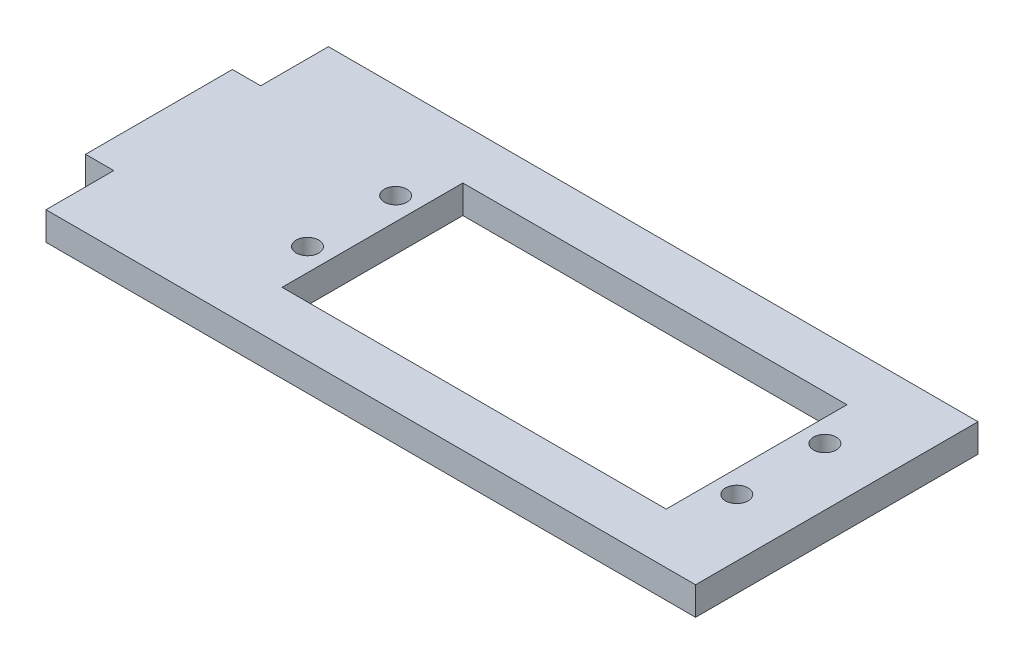
ISO-10303-21;
HEADER;
FILE_DESCRIPTION(('STEP AP214'),'2;1');
FILE_NAME('part.step','',(''),(''),'','','');
FILE_SCHEMA(('AUTOMOTIVE_DESIGN { 1 0 10303 214 1 1 1 1 }'));
ENDSEC;
DATA;
#1=APPLICATION_CONTEXT('core data for automotive mechanical design processes');
#2=APPLICATION_PROTOCOL_DEFINITION('international standard','automotive_design',2000,#1);
#3=PRODUCT_CONTEXT('',#1,'mechanical');
#4=PRODUCT('Part','Part','',(#3));
#5=PRODUCT_RELATED_PRODUCT_CATEGORY('part','',(#4));
#6=PRODUCT_DEFINITION_FORMATION('','',#4);
#7=PRODUCT_DEFINITION_CONTEXT('part definition',#1,'design');
#8=PRODUCT_DEFINITION('design','',#6,#7);
#9=PRODUCT_DEFINITION_SHAPE('','',#8);
#10=(LENGTH_UNIT() NAMED_UNIT(*) SI_UNIT(.MILLI.,.METRE.));
#11=(NAMED_UNIT(*) PLANE_ANGLE_UNIT() SI_UNIT($,.RADIAN.));
#12=(NAMED_UNIT(*) SI_UNIT($,.STERADIAN.) SOLID_ANGLE_UNIT());
#13=UNCERTAINTY_MEASURE_WITH_UNIT(LENGTH_MEASURE(1.E-05),#10,'distance_accuracy_value','');
#14=(GEOMETRIC_REPRESENTATION_CONTEXT(3) GLOBAL_UNCERTAINTY_ASSIGNED_CONTEXT((#13)) GLOBAL_UNIT_ASSIGNED_CONTEXT((#10,
#11,#12)) REPRESENTATION_CONTEXT('',''));
#15=CARTESIAN_POINT('',(0.,0.,0.));
#16=DIRECTION('',(0.,0.,1.));
#17=DIRECTION('',(1.,0.,0.));
#18=AXIS2_PLACEMENT_3D('',#15,#16,#17);
#19=CARTESIAN_POINT('',(43.5055368980985,3.175,-18.2399223929181));
#20=DIRECTION('',(-1.,0.,0.));
#21=DIRECTION('',(0.,0.,1.));
#22=AXIS2_PLACEMENT_3D('',#19,#20,#21);
#23=PLANE('',#22);
#24=DIRECTION('',(0.,0.,-1.));
#25=VECTOR('',#24,1.);
#26=CARTESIAN_POINT('',(43.5055368980985,0.,-18.2399223929181));
#27=LINE('',#26,#25);
#28=CARTESIAN_POINT('',(43.5055368980985,0.,13.5100776070819));
#29=VERTEX_POINT('',#28);
#30=CARTESIAN_POINT('',(43.5055368980985,0.,-18.2399223929181));
#31=VERTEX_POINT('',#30);
#32=EDGE_CURVE('E196',#29,#31,#27,.T.);
#33=ORIENTED_EDGE('',*,*,#32,.T.);
#34=DIRECTION('',(0.,-1.,0.));
#35=VECTOR('',#34,1.);
#36=CARTESIAN_POINT('',(43.5055368980985,3.175,-18.2399223929181));
#37=LINE('',#36,#35);
#38=CARTESIAN_POINT('',(43.5055368980985,3.175,-18.2399223929181));
#39=VERTEX_POINT('',#38);
#40=EDGE_CURVE('E11',#39,#31,#37,.T.);
#41=ORIENTED_EDGE('',*,*,#40,.F.);
#42=DIRECTION('',(0.,0.,-1.));
#43=VECTOR('',#42,1.);
#44=CARTESIAN_POINT('',(43.5055368980985,3.175,-18.2399223929181));
#45=LINE('',#44,#43);
#46=CARTESIAN_POINT('',(43.5055368980985,3.175,13.5100776070819));
#47=VERTEX_POINT('',#46);
#48=EDGE_CURVE('E200',#47,#39,#45,.T.);
#49=ORIENTED_EDGE('',*,*,#48,.F.);
#50=DIRECTION('',(0.,-1.,0.));
#51=VECTOR('',#50,1.);
#52=CARTESIAN_POINT('',(43.5055368980985,3.175,13.5100776070819));
#53=LINE('',#52,#51);
#54=EDGE_CURVE('E42',#47,#29,#53,.T.);
#55=ORIENTED_EDGE('',*,*,#54,.T.);
#56=EDGE_LOOP('',(#33,#41,#49,#55));
#57=FACE_BOUND('',#56,.T.);
#58=ADVANCED_FACE('F35',(#57),#23,.F.);
#59=CARTESIAN_POINT('',(-32.6944631019015,3.175,-18.2399223929181));
#60=DIRECTION('',(0.,0.,1.));
#61=DIRECTION('',(1.,0.,0.));
#62=AXIS2_PLACEMENT_3D('',#59,#60,#61);
#63=PLANE('',#62);
#64=DIRECTION('',(-1.,0.,0.));
#65=VECTOR('',#64,1.);
#66=CARTESIAN_POINT('',(-32.6944631019015,0.,-18.2399223929181));
#67=LINE('',#66,#65);
#68=CARTESIAN_POINT('',(-29.5194631019015,0.,-18.2399223929181));
#69=VERTEX_POINT('',#68);
#70=EDGE_CURVE('E214',#31,#69,#67,.T.);
#71=ORIENTED_EDGE('',*,*,#70,.T.);
#72=DIRECTION('',(0.,1.,0.));
#73=VECTOR('',#72,1.);
#74=CARTESIAN_POINT('',(-29.5194631019015,0.,-18.2399223929181));
#75=LINE('',#74,#73);
#76=CARTESIAN_POINT('',(-29.5194631019015,3.175,-18.2399223929181));
#77=VERTEX_POINT('',#76);
#78=EDGE_CURVE('E193',#69,#77,#75,.T.);
#79=ORIENTED_EDGE('',*,*,#78,.T.);
#80=DIRECTION('',(-1.,0.,0.));
#81=VECTOR('',#80,1.);
#82=CARTESIAN_POINT('',(-32.6944631019015,3.175,-18.2399223929181));
#83=LINE('',#82,#81);
#84=EDGE_CURVE('E203',#39,#77,#83,.T.);
#85=ORIENTED_EDGE('',*,*,#84,.F.);
#86=ORIENTED_EDGE('',*,*,#40,.T.);
#87=EDGE_LOOP('',(#71,#79,#85,#86));
#88=FACE_BOUND('',#87,.T.);
#89=ADVANCED_FACE('F230',(#88),#63,.F.);
#90=CARTESIAN_POINT('',(-32.6944631019015,3.175,-18.2399223929181));
#91=DIRECTION('',(1.,0.,0.));
#92=DIRECTION('',(0.,0.,-1.));
#93=AXIS2_PLACEMENT_3D('',#90,#91,#92);
#94=PLANE('',#93);
#95=DIRECTION('',(0.,0.,1.));
#96=VECTOR('',#95,1.);
#97=CARTESIAN_POINT('',(-32.6944631019015,0.,-18.2399223929181));
#98=LINE('',#97,#96);
#99=CARTESIAN_POINT('',(-32.6944631019015,0.,-10.6199223929181));
#100=VERTEX_POINT('',#99);
#101=CARTESIAN_POINT('',(-32.6944631019015,0.,5.89007760708189));
#102=VERTEX_POINT('',#101);
#103=EDGE_CURVE('E217',#100,#102,#98,.T.);
#104=ORIENTED_EDGE('',*,*,#103,.T.);
#105=DIRECTION('',(0.,1.,0.));
#106=VECTOR('',#105,1.);
#107=CARTESIAN_POINT('',(-32.6944631019015,0.,5.89007760708189));
#108=LINE('',#107,#106);
#109=CARTESIAN_POINT('',(-32.6944631019015,3.175,5.89007760708189));
#110=VERTEX_POINT('',#109);
#111=EDGE_CURVE('E175',#102,#110,#108,.T.);
#112=ORIENTED_EDGE('',*,*,#111,.T.);
#113=DIRECTION('',(0.,0.,1.));
#114=VECTOR('',#113,1.);
#115=CARTESIAN_POINT('',(-32.6944631019015,3.175,-18.2399223929181));
#116=LINE('',#115,#114);
#117=CARTESIAN_POINT('',(-32.6944631019015,3.175,-10.6199223929181));
#118=VERTEX_POINT('',#117);
#119=EDGE_CURVE('E207',#118,#110,#116,.T.);
#120=ORIENTED_EDGE('',*,*,#119,.F.);
#121=DIRECTION('',(0.,1.,0.));
#122=VECTOR('',#121,1.);
#123=CARTESIAN_POINT('',(-32.6944631019015,0.,-10.6199223929181));
#124=LINE('',#123,#122);
#125=EDGE_CURVE('E189',#100,#118,#124,.T.);
#126=ORIENTED_EDGE('',*,*,#125,.F.);
#127=EDGE_LOOP('',(#104,#112,#120,#126));
#128=FACE_BOUND('',#127,.T.);
#129=ADVANCED_FACE('F245',(#128),#94,.F.);
#130=CARTESIAN_POINT('',(-32.6944631019015,3.175,13.5100776070819));
#131=DIRECTION('',(0.,0.,-1.));
#132=DIRECTION('',(-1.,0.,0.));
#133=AXIS2_PLACEMENT_3D('',#130,#131,#132);
#134=PLANE('',#133);
#135=DIRECTION('',(1.,0.,0.));
#136=VECTOR('',#135,1.);
#137=CARTESIAN_POINT('',(-32.6944631019015,3.175,13.5100776070819));
#138=LINE('',#137,#136);
#139=CARTESIAN_POINT('',(-29.5194631019015,3.175,13.5100776070819));
#140=VERTEX_POINT('',#139);
#141=EDGE_CURVE('E210',#140,#47,#138,.T.);
#142=ORIENTED_EDGE('',*,*,#141,.F.);
#143=DIRECTION('',(0.,1.,0.));
#144=VECTOR('',#143,1.);
#145=CARTESIAN_POINT('',(-29.5194631019015,0.,13.5100776070819));
#146=LINE('',#145,#144);
#147=CARTESIAN_POINT('',(-29.5194631019015,0.,13.5100776070819));
#148=VERTEX_POINT('',#147);
#149=EDGE_CURVE('E171',#148,#140,#146,.T.);
#150=ORIENTED_EDGE('',*,*,#149,.F.);
#151=DIRECTION('',(1.,0.,0.));
#152=VECTOR('',#151,1.);
#153=CARTESIAN_POINT('',(-32.6944631019015,0.,13.5100776070819));
#154=LINE('',#153,#152);
#155=EDGE_CURVE('E204',#148,#29,#154,.T.);
#156=ORIENTED_EDGE('',*,*,#155,.T.);
#157=ORIENTED_EDGE('',*,*,#54,.F.);
#158=EDGE_LOOP('',(#142,#150,#156,#157));
#159=FACE_BOUND('',#158,.T.);
#160=ADVANCED_FACE('F237',(#159),#134,.F.);
#161=CARTESIAN_POINT('',(0.,3.175,0.));
#162=DIRECTION('',(0.,1.,0.));
#163=DIRECTION('',(0.,0.,1.));
#164=AXIS2_PLACEMENT_3D('',#161,#162,#163);
#165=PLANE('',#164);
#166=CARTESIAN_POINT('',(-11.2326564780478,3.175,2.39757760708189));
#167=DIRECTION('',(0.,1.,0.));
#168=DIRECTION('',(0.,0.,1.));
#169=AXIS2_PLACEMENT_3D('',#166,#167,#168);
#170=CIRCLE('',#169,1.27);
#171=CARTESIAN_POINT('',(-11.2326564780478,3.175,3.6675776070819));
#172=VERTEX_POINT('',#171);
#173=EDGE_CURVE('E282',#172,#172,#170,.T.);
#174=ORIENTED_EDGE('',*,*,#173,.F.);
#175=EDGE_LOOP('',(#174));
#176=FACE_BOUND('',#175,.T.);
#177=CARTESIAN_POINT('',(-11.2326564780478,3.175,-7.5084223929181));
#178=DIRECTION('',(0.,1.,0.));
#179=DIRECTION('',(0.,0.,1.));
#180=AXIS2_PLACEMENT_3D('',#177,#178,#179);
#181=CIRCLE('',#180,1.27);
#182=CARTESIAN_POINT('',(-11.2326564780478,3.175,-6.2384223929181));
#183=VERTEX_POINT('',#182);
#184=EDGE_CURVE('E286',#183,#183,#181,.T.);
#185=ORIENTED_EDGE('',*,*,#184,.F.);
#186=EDGE_LOOP('',(#185));
#187=FACE_BOUND('',#186,.T.);
#188=CARTESIAN_POINT('',(37.0273435219522,3.175,2.39757760708189));
#189=DIRECTION('',(0.,1.,0.));
#190=DIRECTION('',(0.,0.,1.));
#191=AXIS2_PLACEMENT_3D('',#188,#189,#190);
#192=CIRCLE('',#191,1.27);
#193=CARTESIAN_POINT('',(37.0273435219522,3.175,3.66757760708189));
#194=VERTEX_POINT('',#193);
#195=EDGE_CURVE('E290',#194,#194,#192,.T.);
#196=ORIENTED_EDGE('',*,*,#195,.F.);
#197=EDGE_LOOP('',(#196));
#198=FACE_BOUND('',#197,.T.);
#199=CARTESIAN_POINT('',(37.0273435219522,3.175,-7.50842239291811));
#200=DIRECTION('',(0.,1.,0.));
#201=DIRECTION('',(0.,0.,1.));
#202=AXIS2_PLACEMENT_3D('',#199,#200,#201);
#203=CIRCLE('',#202,1.27);
#204=CARTESIAN_POINT('',(37.0273435219522,3.175,-6.23842239291811));
#205=VERTEX_POINT('',#204);
#206=EDGE_CURVE('E147',#205,#205,#203,.T.);
#207=ORIENTED_EDGE('',*,*,#206,.F.);
#208=EDGE_LOOP('',(#207));
#209=FACE_BOUND('',#208,.T.);
#210=DIRECTION('',(0.,0.,-1.));
#211=VECTOR('',#210,1.);
#212=CARTESIAN_POINT('',(34.4873435219522,3.175,-12.5249223929181));
#213=LINE('',#212,#211);
#214=CARTESIAN_POINT('',(34.4873435219522,3.175,7.7950776070819));
#215=VERTEX_POINT('',#214);
#216=CARTESIAN_POINT('',(34.4873435219522,3.175,-12.5249223929181));
#217=VERTEX_POINT('',#216);
#218=EDGE_CURVE('E49',#215,#217,#213,.T.);
#219=ORIENTED_EDGE('',*,*,#218,.F.);
#220=DIRECTION('',(1.,0.,0.));
#221=VECTOR('',#220,1.);
#222=CARTESIAN_POINT('',(-8.69265647804785,3.175,7.7950776070819));
#223=LINE('',#222,#221);
#224=CARTESIAN_POINT('',(-8.69265647804785,3.175,7.7950776070819));
#225=VERTEX_POINT('',#224);
#226=EDGE_CURVE('E141',#225,#215,#223,.T.);
#227=ORIENTED_EDGE('',*,*,#226,.F.);
#228=DIRECTION('',(0.,0.,1.));
#229=VECTOR('',#228,1.);
#230=CARTESIAN_POINT('',(-8.69265647804785,3.175,-12.5249223929181));
#231=LINE('',#230,#229);
#232=CARTESIAN_POINT('',(-8.69265647804785,3.175,-12.5249223929181));
#233=VERTEX_POINT('',#232);
#234=EDGE_CURVE('E144',#233,#225,#231,.T.);
#235=ORIENTED_EDGE('',*,*,#234,.F.);
#236=DIRECTION('',(-1.,0.,0.));
#237=VECTOR('',#236,1.);
#238=CARTESIAN_POINT('',(-8.69265647804785,3.175,-12.5249223929181));
#239=LINE('',#238,#237);
#240=EDGE_CURVE('E153',#217,#233,#239,.T.);
#241=ORIENTED_EDGE('',*,*,#240,.F.);
#242=EDGE_LOOP('',(#219,#227,#235,#241));
#243=FACE_BOUND('',#242,.T.);
#244=DIRECTION('',(-1.,0.,0.));
#245=VECTOR('',#244,1.);
#246=CARTESIAN_POINT('',(-32.6944631019015,3.175,5.89007760708189));
#247=LINE('',#246,#245);
#248=CARTESIAN_POINT('',(-29.5194631019015,3.175,5.89007760708189));
#249=VERTEX_POINT('',#248);
#250=EDGE_CURVE('E168',#249,#110,#247,.T.);
#251=ORIENTED_EDGE('',*,*,#250,.F.);
#252=DIRECTION('',(0.,0.,-1.));
#253=VECTOR('',#252,1.);
#254=CARTESIAN_POINT('',(-29.5194631019015,3.175,13.5100776070819));
#255=LINE('',#254,#253);
#256=EDGE_CURVE('E160',#140,#249,#255,.T.);
#257=ORIENTED_EDGE('',*,*,#256,.F.);
#258=ORIENTED_EDGE('',*,*,#141,.T.);
#259=ORIENTED_EDGE('',*,*,#48,.T.);
#260=ORIENTED_EDGE('',*,*,#84,.T.);
#261=DIRECTION('',(0.,0.,-1.));
#262=VECTOR('',#261,1.);
#263=CARTESIAN_POINT('',(-29.5194631019015,3.175,-18.2399223929181));
#264=LINE('',#263,#262);
#265=CARTESIAN_POINT('',(-29.5194631019015,3.175,-10.6199223929181));
#266=VERTEX_POINT('',#265);
#267=EDGE_CURVE('E186',#266,#77,#264,.T.);
#268=ORIENTED_EDGE('',*,*,#267,.F.);
#269=DIRECTION('',(1.,0.,0.));
#270=VECTOR('',#269,1.);
#271=CARTESIAN_POINT('',(-32.6944631019015,3.175,-10.6199223929181));
#272=LINE('',#271,#270);
#273=EDGE_CURVE('E178',#118,#266,#272,.T.);
#274=ORIENTED_EDGE('',*,*,#273,.F.);
#275=ORIENTED_EDGE('',*,*,#119,.T.);
#276=EDGE_LOOP('',(#251,#257,#258,#259,#260,#268,#274,#275));
#277=FACE_BOUND('',#276,.T.);
#278=ADVANCED_FACE('F234',(#176,#187,#198,#209,#243,#277),#165,.T.);
#279=CARTESIAN_POINT('',(0.,0.,0.));
#280=DIRECTION('',(0.,1.,0.));
#281=DIRECTION('',(0.,0.,1.));
#282=AXIS2_PLACEMENT_3D('',#279,#280,#281);
#283=PLANE('',#282);
#284=CARTESIAN_POINT('',(-11.2326564780478,0.,2.39757760708189));
#285=DIRECTION('',(0.,1.,0.));
#286=DIRECTION('',(0.,0.,1.));
#287=AXIS2_PLACEMENT_3D('',#284,#285,#286);
#288=CIRCLE('',#287,1.27);
#289=CARTESIAN_POINT('',(-11.2326564780478,0.,3.6675776070819));
#290=VERTEX_POINT('',#289);
#291=EDGE_CURVE('E383',#290,#290,#288,.T.);
#292=ORIENTED_EDGE('',*,*,#291,.T.);
#293=EDGE_LOOP('',(#292));
#294=FACE_BOUND('',#293,.T.);
#295=CARTESIAN_POINT('',(-11.2326564780478,0.,-7.5084223929181));
#296=DIRECTION('',(0.,1.,0.));
#297=DIRECTION('',(0.,0.,1.));
#298=AXIS2_PLACEMENT_3D('',#295,#296,#297);
#299=CIRCLE('',#298,1.27);
#300=CARTESIAN_POINT('',(-11.2326564780478,0.,-6.2384223929181));
#301=VERTEX_POINT('',#300);
#302=EDGE_CURVE('E387',#301,#301,#299,.T.);
#303=ORIENTED_EDGE('',*,*,#302,.T.);
#304=EDGE_LOOP('',(#303));
#305=FACE_BOUND('',#304,.T.);
#306=CARTESIAN_POINT('',(37.0273435219522,0.,2.39757760708189));
#307=DIRECTION('',(0.,1.,0.));
#308=DIRECTION('',(0.,0.,1.));
#309=AXIS2_PLACEMENT_3D('',#306,#307,#308);
#310=CIRCLE('',#309,1.27);
#311=CARTESIAN_POINT('',(37.0273435219522,0.,3.66757760708189));
#312=VERTEX_POINT('',#311);
#313=EDGE_CURVE('E391',#312,#312,#310,.T.);
#314=ORIENTED_EDGE('',*,*,#313,.T.);
#315=EDGE_LOOP('',(#314));
#316=FACE_BOUND('',#315,.T.);
#317=CARTESIAN_POINT('',(37.0273435219522,0.,-7.50842239291811));
#318=DIRECTION('',(0.,1.,0.));
#319=DIRECTION('',(0.,0.,1.));
#320=AXIS2_PLACEMENT_3D('',#317,#318,#319);
#321=CIRCLE('',#320,1.27);
#322=CARTESIAN_POINT('',(37.0273435219522,0.,-6.23842239291811));
#323=VERTEX_POINT('',#322);
#324=EDGE_CURVE('E154',#323,#323,#321,.T.);
#325=ORIENTED_EDGE('',*,*,#324,.T.);
#326=EDGE_LOOP('',(#325));
#327=FACE_BOUND('',#326,.T.);
#328=DIRECTION('',(1.,0.,0.));
#329=VECTOR('',#328,1.);
#330=CARTESIAN_POINT('',(-8.69265647804785,0.,7.7950776070819));
#331=LINE('',#330,#329);
#332=CARTESIAN_POINT('',(-8.69265647804785,0.,7.7950776070819));
#333=VERTEX_POINT('',#332);
#334=CARTESIAN_POINT('',(34.4873435219522,0.,7.7950776070819));
#335=VERTEX_POINT('',#334);
#336=EDGE_CURVE('E131',#333,#335,#331,.T.);
#337=ORIENTED_EDGE('',*,*,#336,.T.);
#338=DIRECTION('',(0.,0.,-1.));
#339=VECTOR('',#338,1.);
#340=CARTESIAN_POINT('',(34.4873435219522,0.,-12.5249223929181));
#341=LINE('',#340,#339);
#342=CARTESIAN_POINT('',(34.4873435219522,0.,-12.5249223929181));
#343=VERTEX_POINT('',#342);
#344=EDGE_CURVE('E125',#335,#343,#341,.T.);
#345=ORIENTED_EDGE('',*,*,#344,.T.);
#346=DIRECTION('',(-1.,0.,0.));
#347=VECTOR('',#346,1.);
#348=CARTESIAN_POINT('',(-8.69265647804785,0.,-12.5249223929181));
#349=LINE('',#348,#347);
#350=CARTESIAN_POINT('',(-8.69265647804785,0.,-12.5249223929181));
#351=VERTEX_POINT('',#350);
#352=EDGE_CURVE('E134',#343,#351,#349,.T.);
#353=ORIENTED_EDGE('',*,*,#352,.T.);
#354=DIRECTION('',(0.,0.,1.));
#355=VECTOR('',#354,1.);
#356=CARTESIAN_POINT('',(-8.69265647804785,0.,-12.5249223929181));
#357=LINE('',#356,#355);
#358=EDGE_CURVE('E57',#351,#333,#357,.T.);
#359=ORIENTED_EDGE('',*,*,#358,.T.);
#360=EDGE_LOOP('',(#337,#345,#353,#359));
#361=FACE_BOUND('',#360,.T.);
#362=DIRECTION('',(0.,0.,-1.));
#363=VECTOR('',#362,1.);
#364=CARTESIAN_POINT('',(-29.5194631019015,0.,13.5100776070819));
#365=LINE('',#364,#363);
#366=CARTESIAN_POINT('',(-29.5194631019015,0.,5.89007760708189));
#367=VERTEX_POINT('',#366);
#368=EDGE_CURVE('E164',#148,#367,#365,.T.);
#369=ORIENTED_EDGE('',*,*,#368,.T.);
#370=DIRECTION('',(-1.,0.,0.));
#371=VECTOR('',#370,1.);
#372=CARTESIAN_POINT('',(-32.6944631019015,0.,5.89007760708189));
#373=LINE('',#372,#371);
#374=EDGE_CURVE('E167',#367,#102,#373,.T.);
#375=ORIENTED_EDGE('',*,*,#374,.T.);
#376=ORIENTED_EDGE('',*,*,#103,.F.);
#377=DIRECTION('',(1.,0.,0.));
#378=VECTOR('',#377,1.);
#379=CARTESIAN_POINT('',(-32.6944631019015,0.,-10.6199223929181));
#380=LINE('',#379,#378);
#381=CARTESIAN_POINT('',(-29.5194631019015,0.,-10.6199223929181));
#382=VERTEX_POINT('',#381);
#383=EDGE_CURVE('E182',#100,#382,#380,.T.);
#384=ORIENTED_EDGE('',*,*,#383,.T.);
#385=DIRECTION('',(0.,0.,-1.));
#386=VECTOR('',#385,1.);
#387=CARTESIAN_POINT('',(-29.5194631019015,0.,-18.2399223929181));
#388=LINE('',#387,#386);
#389=EDGE_CURVE('E185',#382,#69,#388,.T.);
#390=ORIENTED_EDGE('',*,*,#389,.T.);
#391=ORIENTED_EDGE('',*,*,#70,.F.);
#392=ORIENTED_EDGE('',*,*,#32,.F.);
#393=ORIENTED_EDGE('',*,*,#155,.F.);
#394=EDGE_LOOP('',(#369,#375,#376,#384,#390,#391,#392,#393));
#395=FACE_BOUND('',#394,.T.);
#396=ADVANCED_FACE('F138',(#294,#305,#316,#327,#361,#395),#283,.F.);
#397=CARTESIAN_POINT('',(-29.5194631019015,0.,-18.2399223929181));
#398=DIRECTION('',(1.,0.,0.));
#399=DIRECTION('',(0.,0.,-1.));
#400=AXIS2_PLACEMENT_3D('',#397,#398,#399);
#401=PLANE('',#400);
#402=ORIENTED_EDGE('',*,*,#267,.T.);
#403=ORIENTED_EDGE('',*,*,#78,.F.);
#404=ORIENTED_EDGE('',*,*,#389,.F.);
#405=DIRECTION('',(0.,1.,0.));
#406=VECTOR('',#405,1.);
#407=CARTESIAN_POINT('',(-29.5194631019015,0.,-10.6199223929181));
#408=LINE('',#407,#406);
#409=EDGE_CURVE('E197',#382,#266,#408,.T.);
#410=ORIENTED_EDGE('',*,*,#409,.T.);
#411=EDGE_LOOP('',(#402,#403,#404,#410));
#412=FACE_BOUND('',#411,.T.);
#413=ADVANCED_FACE('F252',(#412),#401,.F.);
#414=CARTESIAN_POINT('',(-32.6944631019015,0.,-10.6199223929181));
#415=DIRECTION('',(0.,0.,1.));
#416=DIRECTION('',(1.,0.,0.));
#417=AXIS2_PLACEMENT_3D('',#414,#415,#416);
#418=PLANE('',#417);
#419=ORIENTED_EDGE('',*,*,#273,.T.);
#420=ORIENTED_EDGE('',*,*,#409,.F.);
#421=ORIENTED_EDGE('',*,*,#383,.F.);
#422=ORIENTED_EDGE('',*,*,#125,.T.);
#423=EDGE_LOOP('',(#419,#420,#421,#422));
#424=FACE_BOUND('',#423,.T.);
#425=ADVANCED_FACE('F249',(#424),#418,.F.);
#426=CARTESIAN_POINT('',(-32.6944631019015,0.,5.89007760708189));
#427=DIRECTION('',(0.,0.,-1.));
#428=DIRECTION('',(-1.,0.,0.));
#429=AXIS2_PLACEMENT_3D('',#426,#427,#428);
#430=PLANE('',#429);
#431=ORIENTED_EDGE('',*,*,#250,.T.);
#432=ORIENTED_EDGE('',*,*,#111,.F.);
#433=ORIENTED_EDGE('',*,*,#374,.F.);
#434=DIRECTION('',(0.,1.,0.));
#435=VECTOR('',#434,1.);
#436=CARTESIAN_POINT('',(-29.5194631019015,0.,5.89007760708189));
#437=LINE('',#436,#435);
#438=EDGE_CURVE('E179',#367,#249,#437,.T.);
#439=ORIENTED_EDGE('',*,*,#438,.T.);
#440=EDGE_LOOP('',(#431,#432,#433,#439));
#441=FACE_BOUND('',#440,.T.);
#442=ADVANCED_FACE('F259',(#441),#430,.F.);
#443=CARTESIAN_POINT('',(-29.5194631019015,0.,13.5100776070819));
#444=DIRECTION('',(1.,0.,0.));
#445=DIRECTION('',(0.,0.,-1.));
#446=AXIS2_PLACEMENT_3D('',#443,#444,#445);
#447=PLANE('',#446);
#448=ORIENTED_EDGE('',*,*,#256,.T.);
#449=ORIENTED_EDGE('',*,*,#438,.F.);
#450=ORIENTED_EDGE('',*,*,#368,.F.);
#451=ORIENTED_EDGE('',*,*,#149,.T.);
#452=EDGE_LOOP('',(#448,#449,#450,#451));
#453=FACE_BOUND('',#452,.T.);
#454=ADVANCED_FACE('F239',(#453),#447,.F.);
#455=CARTESIAN_POINT('',(34.4873435219522,0.,-12.5249223929181));
#456=DIRECTION('',(1.,0.,0.));
#457=DIRECTION('',(0.,0.,-1.));
#458=AXIS2_PLACEMENT_3D('',#455,#456,#457);
#459=PLANE('',#458);
#460=ORIENTED_EDGE('',*,*,#218,.T.);
#461=DIRECTION('',(0.,1.,0.));
#462=VECTOR('',#461,1.);
#463=CARTESIAN_POINT('',(34.4873435219522,0.,-12.5249223929181));
#464=LINE('',#463,#462);
#465=EDGE_CURVE('E121',#343,#217,#464,.T.);
#466=ORIENTED_EDGE('',*,*,#465,.F.);
#467=ORIENTED_EDGE('',*,*,#344,.F.);
#468=DIRECTION('',(0.,1.,0.));
#469=VECTOR('',#468,1.);
#470=CARTESIAN_POINT('',(34.4873435219522,0.,7.7950776070819));
#471=LINE('',#470,#469);
#472=EDGE_CURVE('E158',#335,#215,#471,.T.);
#473=ORIENTED_EDGE('',*,*,#472,.T.);
#474=EDGE_LOOP('',(#460,#466,#467,#473));
#475=FACE_BOUND('',#474,.T.);
#476=ADVANCED_FACE('F123',(#475),#459,.F.);
#477=CARTESIAN_POINT('',(-8.69265647804785,0.,7.7950776070819));
#478=DIRECTION('',(0.,0.,1.));
#479=DIRECTION('',(1.,0.,0.));
#480=AXIS2_PLACEMENT_3D('',#477,#478,#479);
#481=PLANE('',#480);
#482=ORIENTED_EDGE('',*,*,#226,.T.);
#483=ORIENTED_EDGE('',*,*,#472,.F.);
#484=ORIENTED_EDGE('',*,*,#336,.F.);
#485=DIRECTION('',(0.,1.,0.));
#486=VECTOR('',#485,1.);
#487=CARTESIAN_POINT('',(-8.69265647804785,0.,7.7950776070819));
#488=LINE('',#487,#486);
#489=EDGE_CURVE('E161',#333,#225,#488,.T.);
#490=ORIENTED_EDGE('',*,*,#489,.T.);
#491=EDGE_LOOP('',(#482,#483,#484,#490));
#492=FACE_BOUND('',#491,.T.);
#493=ADVANCED_FACE('F298',(#492),#481,.F.);
#494=CARTESIAN_POINT('',(-8.69265647804785,0.,-12.5249223929181));
#495=DIRECTION('',(-1.,0.,0.));
#496=DIRECTION('',(0.,0.,1.));
#497=AXIS2_PLACEMENT_3D('',#494,#495,#496);
#498=PLANE('',#497);
#499=ORIENTED_EDGE('',*,*,#234,.T.);
#500=ORIENTED_EDGE('',*,*,#489,.F.);
#501=ORIENTED_EDGE('',*,*,#358,.F.);
#502=DIRECTION('',(0.,1.,0.));
#503=VECTOR('',#502,1.);
#504=CARTESIAN_POINT('',(-8.69265647804785,0.,-12.5249223929181));
#505=LINE('',#504,#503);
#506=EDGE_CURVE('E130',#351,#233,#505,.T.);
#507=ORIENTED_EDGE('',*,*,#506,.T.);
#508=EDGE_LOOP('',(#499,#500,#501,#507));
#509=FACE_BOUND('',#508,.T.);
#510=ADVANCED_FACE('F296',(#509),#498,.F.);
#511=CARTESIAN_POINT('',(-8.69265647804785,0.,-12.5249223929181));
#512=DIRECTION('',(0.,0.,-1.));
#513=DIRECTION('',(-1.,0.,0.));
#514=AXIS2_PLACEMENT_3D('',#511,#512,#513);
#515=PLANE('',#514);
#516=ORIENTED_EDGE('',*,*,#240,.T.);
#517=ORIENTED_EDGE('',*,*,#506,.F.);
#518=ORIENTED_EDGE('',*,*,#352,.F.);
#519=ORIENTED_EDGE('',*,*,#465,.T.);
#520=EDGE_LOOP('',(#516,#517,#518,#519));
#521=FACE_BOUND('',#520,.T.);
#522=ADVANCED_FACE('F135',(#521),#515,.F.);
#523=CARTESIAN_POINT('',(37.0273435219522,0.,-7.50842239291811));
#524=DIRECTION('',(0.,1.,0.));
#525=DIRECTION('',(0.,0.,1.));
#526=AXIS2_PLACEMENT_3D('',#523,#524,#525);
#527=CYLINDRICAL_SURFACE('',#526,1.27);
#528=ORIENTED_EDGE('',*,*,#324,.F.);
#529=EDGE_LOOP('',(#528));
#530=FACE_BOUND('',#529,.T.);
#531=ORIENTED_EDGE('',*,*,#206,.T.);
#532=EDGE_LOOP('',(#531));
#533=FACE_BOUND('',#532,.T.);
#534=ADVANCED_FACE('F308',(#530,#533),#527,.F.);
#535=CARTESIAN_POINT('',(37.0273435219522,0.,2.39757760708189));
#536=DIRECTION('',(0.,1.,0.));
#537=DIRECTION('',(0.,0.,1.));
#538=AXIS2_PLACEMENT_3D('',#535,#536,#537);
#539=CYLINDRICAL_SURFACE('',#538,1.27);
#540=ORIENTED_EDGE('',*,*,#313,.F.);
#541=EDGE_LOOP('',(#540));
#542=FACE_BOUND('',#541,.T.);
#543=ORIENTED_EDGE('',*,*,#195,.T.);
#544=EDGE_LOOP('',(#543));
#545=FACE_BOUND('',#544,.T.);
#546=ADVANCED_FACE('F348',(#542,#545),#539,.F.);
#547=CARTESIAN_POINT('',(-11.2326564780478,0.,-7.5084223929181));
#548=DIRECTION('',(0.,1.,0.));
#549=DIRECTION('',(0.,0.,1.));
#550=AXIS2_PLACEMENT_3D('',#547,#548,#549);
#551=CYLINDRICAL_SURFACE('',#550,1.27);
#552=ORIENTED_EDGE('',*,*,#302,.F.);
#553=EDGE_LOOP('',(#552));
#554=FACE_BOUND('',#553,.T.);
#555=ORIENTED_EDGE('',*,*,#184,.T.);
#556=EDGE_LOOP('',(#555));
#557=FACE_BOUND('',#556,.T.);
#558=ADVANCED_FACE('F357',(#554,#557),#551,.F.);
#559=CARTESIAN_POINT('',(-11.2326564780478,0.,2.39757760708189));
#560=DIRECTION('',(0.,1.,0.));
#561=DIRECTION('',(0.,0.,1.));
#562=AXIS2_PLACEMENT_3D('',#559,#560,#561);
#563=CYLINDRICAL_SURFACE('',#562,1.27);
#564=ORIENTED_EDGE('',*,*,#291,.F.);
#565=EDGE_LOOP('',(#564));
#566=FACE_BOUND('',#565,.T.);
#567=ORIENTED_EDGE('',*,*,#173,.T.);
#568=EDGE_LOOP('',(#567));
#569=FACE_BOUND('',#568,.T.);
#570=ADVANCED_FACE('F366',(#566,#569),#563,.F.);
#571=CLOSED_SHELL('',(#58,#89,#129,#160,#278,#396,#413,#425,#442,#454,#476,#493,#510,#522,#534,
#546,#558,#570));
#572=MANIFOLD_SOLID_BREP('B2',#571);
#573=ADVANCED_BREP_SHAPE_REPRESENTATION('',(#18,#572),#14);
#574=SHAPE_DEFINITION_REPRESENTATION(#9,#573);
ENDSEC;
END-ISO-10303-21;
